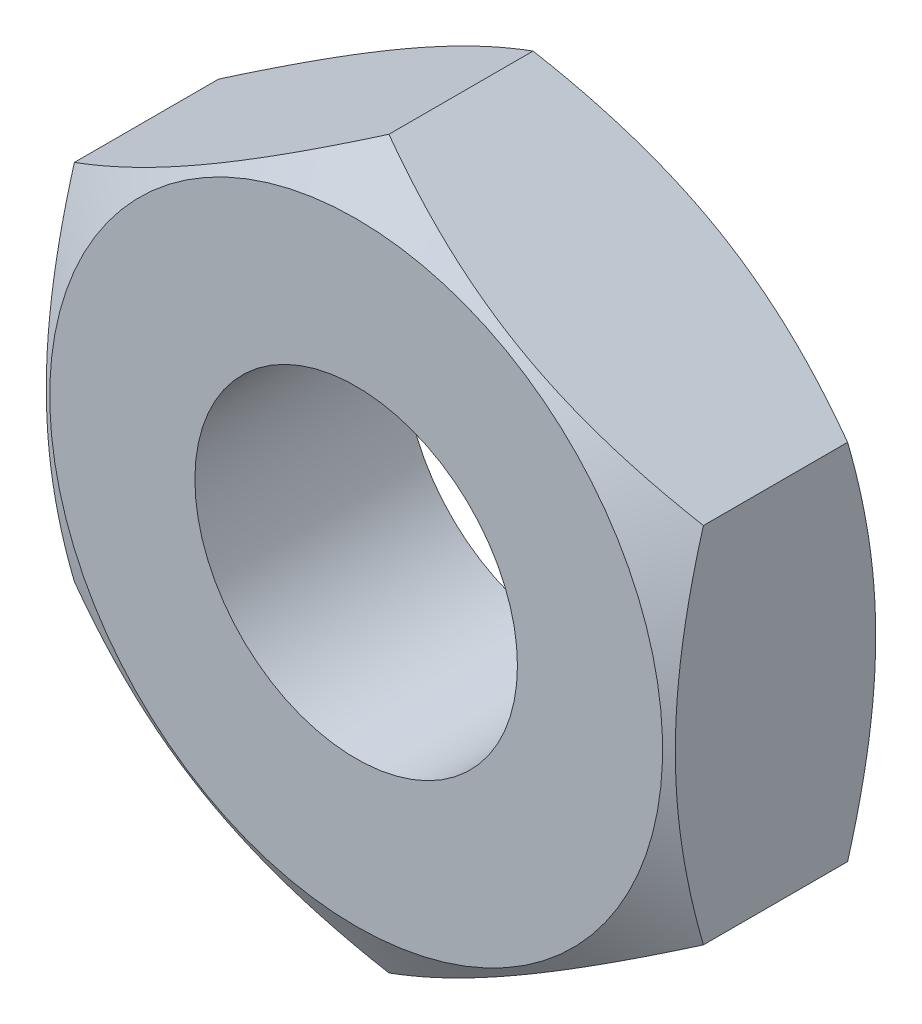
ISO-10303-21;
HEADER;
FILE_DESCRIPTION(('STEP AP214'),'2;1');
FILE_NAME('part.step','',(''),(''),'','','');
FILE_SCHEMA(('AUTOMOTIVE_DESIGN { 1 0 10303 214 1 1 1 1 }'));
ENDSEC;
DATA;
#1=APPLICATION_CONTEXT('core data for automotive mechanical design processes');
#2=APPLICATION_PROTOCOL_DEFINITION('international standard','automotive_design',2000,#1);
#3=PRODUCT_CONTEXT('',#1,'mechanical');
#4=PRODUCT('Part','Part','',(#3));
#5=PRODUCT_RELATED_PRODUCT_CATEGORY('part','',(#4));
#6=PRODUCT_DEFINITION_FORMATION('','',#4);
#7=PRODUCT_DEFINITION_CONTEXT('part definition',#1,'design');
#8=PRODUCT_DEFINITION('design','',#6,#7);
#9=PRODUCT_DEFINITION_SHAPE('','',#8);
#10=(LENGTH_UNIT() NAMED_UNIT(*) SI_UNIT(.MILLI.,.METRE.));
#11=(NAMED_UNIT(*) PLANE_ANGLE_UNIT() SI_UNIT($,.RADIAN.));
#12=(NAMED_UNIT(*) SI_UNIT($,.STERADIAN.) SOLID_ANGLE_UNIT());
#13=UNCERTAINTY_MEASURE_WITH_UNIT(LENGTH_MEASURE(1.E-05),#10,'distance_accuracy_value','');
#14=(GEOMETRIC_REPRESENTATION_CONTEXT(3) GLOBAL_UNCERTAINTY_ASSIGNED_CONTEXT((#13)) GLOBAL_UNIT_ASSIGNED_CONTEXT((#10,
#11,#12)) REPRESENTATION_CONTEXT('',''));
#15=CARTESIAN_POINT('',(0.,0.,0.));
#16=DIRECTION('',(0.,0.,1.));
#17=DIRECTION('',(1.,0.,0.));
#18=AXIS2_PLACEMENT_3D('',#15,#16,#17);
#19=CARTESIAN_POINT('',(0.,0.,1.3));
#20=DIRECTION('',(0.,0.,1.));
#21=DIRECTION('',(1.,0.,0.));
#22=AXIS2_PLACEMENT_3D('',#19,#20,#21);
#23=PLANE('',#22);
#24=CARTESIAN_POINT('',(0.,0.,1.3));
#25=DIRECTION('',(0.,0.,1.));
#26=DIRECTION('',(1.,0.,0.));
#27=AXIS2_PLACEMENT_3D('',#24,#25,#26);
#28=CIRCLE('',#27,1.);
#29=CARTESIAN_POINT('',(1.,0.,1.3));
#30=VERTEX_POINT('',#29);
#31=EDGE_CURVE('E115',#30,#30,#28,.T.);
#32=ORIENTED_EDGE('',*,*,#31,.F.);
#33=EDGE_LOOP('',(#32));
#34=FACE_BOUND('',#33,.T.);
#35=CARTESIAN_POINT('',(0.,0.,1.3));
#36=DIRECTION('',(0.,0.,1.));
#37=DIRECTION('',(0.,-1.,0.));
#38=AXIS2_PLACEMENT_3D('',#35,#36,#37);
#39=CIRCLE('',#38,1.9);
#40=CARTESIAN_POINT('',(0.,-1.9,1.3));
#41=VERTEX_POINT('',#40);
#42=EDGE_CURVE('E108',#41,#41,#39,.T.);
#43=ORIENTED_EDGE('',*,*,#42,.T.);
#44=EDGE_LOOP('',(#43));
#45=FACE_BOUND('',#44,.T.);
#46=ADVANCED_FACE('F36',(#34,#45),#23,.T.);
#47=CARTESIAN_POINT('',(0.,0.,0.));
#48=DIRECTION('',(0.,0.,1.));
#49=DIRECTION('',(1.,0.,0.));
#50=AXIS2_PLACEMENT_3D('',#47,#48,#49);
#51=PLANE('',#50);
#52=CARTESIAN_POINT('',(0.,0.,0.));
#53=DIRECTION('',(0.,0.,1.));
#54=DIRECTION('',(1.,0.,0.));
#55=AXIS2_PLACEMENT_3D('',#52,#53,#54);
#56=CIRCLE('',#55,1.);
#57=CARTESIAN_POINT('',(1.,0.,0.));
#58=VERTEX_POINT('',#57);
#59=EDGE_CURVE('E195',#58,#58,#56,.T.);
#60=ORIENTED_EDGE('',*,*,#59,.T.);
#61=EDGE_LOOP('',(#60));
#62=FACE_BOUND('',#61,.T.);
#63=CARTESIAN_POINT('',(0.,0.,0.));
#64=DIRECTION('',(0.,0.,1.));
#65=DIRECTION('',(0.,-1.,0.));
#66=AXIS2_PLACEMENT_3D('',#63,#64,#65);
#67=CIRCLE('',#66,1.9);
#68=CARTESIAN_POINT('',(0.,-1.9,0.));
#69=VERTEX_POINT('',#68);
#70=EDGE_CURVE('E217',#69,#69,#67,.T.);
#71=ORIENTED_EDGE('',*,*,#70,.F.);
#72=EDGE_LOOP('',(#71));
#73=FACE_BOUND('',#72,.T.);
#74=ADVANCED_FACE('F200',(#62,#73),#51,.F.);
#75=CARTESIAN_POINT('',(0.,0.,1.3));
#76=DIRECTION('',(0.,0.,-1.));
#77=DIRECTION('',(-1.,0.,0.));
#78=AXIS2_PLACEMENT_3D('',#75,#76,#77);
#79=CYLINDRICAL_SURFACE('',#78,1.);
#80=ORIENTED_EDGE('',*,*,#31,.T.);
#81=EDGE_LOOP('',(#80));
#82=FACE_BOUND('',#81,.T.);
#83=ORIENTED_EDGE('',*,*,#59,.F.);
#84=EDGE_LOOP('',(#83));
#85=FACE_BOUND('',#84,.T.);
#86=ADVANCED_FACE('F136',(#82,#85),#79,.F.);
#87=CARTESIAN_POINT('',(0.,0.,0.));
#88=DIRECTION('',(0.,0.,1.));
#89=DIRECTION('',(0.,-1.,0.));
#90=AXIS2_PLACEMENT_3D('',#87,#88,#89);
#91=CONICAL_SURFACE('',#90,1.9,1.04719755119659);
#92=ORIENTED_EDGE('',*,*,#70,.T.);
#93=EDGE_LOOP('',(#92));
#94=FACE_BOUND('',#93,.T.);
#95=CARTESIAN_POINT('',(1.95,-3.01412357062755,0.975668955348615));
#96=CARTESIAN_POINT('',(1.95,-2.92903782794884,0.93443505977196));
#97=CARTESIAN_POINT('',(1.95,-2.84375568637844,0.893599436545652));
#98=CARTESIAN_POINT('',(1.95,-2.67269412413965,0.81294893406325));
#99=CARTESIAN_POINT('',(1.95,-2.58691462676543,0.773134217685977));
#100=CARTESIAN_POINT('',(1.95,-2.414307090545,0.694547275824721));
#101=CARTESIAN_POINT('',(1.95,-2.32747587913931,0.655781994254316));
#102=CARTESIAN_POINT('',(1.95,-2.15311932004655,0.579851257331476));
#103=CARTESIAN_POINT('',(1.95,-2.06559400568914,0.542685725705999));
#104=CARTESIAN_POINT('',(1.95,-1.88691398070035,0.469227673671));
#105=CARTESIAN_POINT('',(1.95,-1.79573230094289,0.433000392203774));
#106=CARTESIAN_POINT('',(1.95,-1.61231715451437,0.363319471267221));
#107=CARTESIAN_POINT('',(1.95,-1.52008378592712,0.329865575511403));
#108=CARTESIAN_POINT('',(1.95,-1.33456658875307,0.266605328393311));
#109=CARTESIAN_POINT('',(1.95,-1.24128521000729,0.236791865351117));
#110=CARTESIAN_POINT('',(1.95,-1.053384509019,0.181779686924461));
#111=CARTESIAN_POINT('',(1.95,-0.958765621579301,0.15657950738157));
#112=CARTESIAN_POINT('',(1.95,-0.768659527742966,0.112143681714311));
#113=CARTESIAN_POINT('',(1.95,-0.673179938310397,0.0928760555926613));
#114=CARTESIAN_POINT('',(1.95,-0.481044685139464,0.061400356588822));
#115=CARTESIAN_POINT('',(1.95,-0.384389130454296,0.0491916341175885));
#116=CARTESIAN_POINT('',(1.95,-0.191639372884253,0.032970989015226));
#117=CARTESIAN_POINT('',(1.95,-0.0955542280348244,0.0288544872510814));
#118=CARTESIAN_POINT('',(1.95,0.0966116278792717,0.0288806223858111));
#119=CARTESIAN_POINT('',(1.95,0.192692338802003,0.0330234389685632));
#120=CARTESIAN_POINT('',(1.95,0.423801711941466,0.052559927726958));
#121=CARTESIAN_POINT('',(1.95,0.558498797282693,0.0718991133974967));
#122=CARTESIAN_POINT('',(1.95,0.82542389416129,0.123398592908946));
#123=CARTESIAN_POINT('',(1.95,0.95764932892324,0.155571562448242));
#124=CARTESIAN_POINT('',(1.95,1.22228940670491,0.230040389841523));
#125=CARTESIAN_POINT('',(1.95,1.35464415177668,0.272543477596809));
#126=CARTESIAN_POINT('',(1.95,1.61689691634488,0.364311980704714));
#127=CARTESIAN_POINT('',(1.95,1.74679561828244,0.413575485216861));
#128=CARTESIAN_POINT('',(1.95,2.04811719504485,0.53416783948814));
#129=CARTESIAN_POINT('',(1.95,2.21879429378613,0.60734105858785));
#130=CARTESIAN_POINT('',(1.95,2.55780255121915,0.75896561844231));
#131=CARTESIAN_POINT('',(1.95,2.72613309667796,0.837418308802652));
#132=CARTESIAN_POINT('',(1.95,3.06128174435966,0.997884283184612));
#133=CARTESIAN_POINT('',(1.95,3.22809821178325,1.0799009644798));
#134=CARTESIAN_POINT('',(1.95,3.56053412757571,1.24632763510264));
#135=CARTESIAN_POINT('',(1.95,3.72615353627982,1.33073770328351));
#136=CARTESIAN_POINT('',(1.95,4.04298616941857,1.49427845670639));
#137=CARTESIAN_POINT('',(1.95,4.19426856460931,1.57327547781696));
#138=CARTESIAN_POINT('',(1.95,4.49626868091635,1.73235219719295));
#139=CARTESIAN_POINT('',(1.95,4.64698638309302,1.81243193136437));
#140=CARTESIAN_POINT('',(1.95,4.94761914522595,1.97322608598776));
#141=CARTESIAN_POINT('',(1.95,5.09753526257818,2.05393853216987));
#142=CARTESIAN_POINT('',(1.95,5.39700518556908,2.2160141900077));
#143=CARTESIAN_POINT('',(1.95,5.54655901000312,2.29737736691952));
#144=CARTESIAN_POINT('',(1.95,5.69597890155467,2.37898403012575));
#145=B_SPLINE_CURVE_WITH_KNOTS('',3,(#95,#96,#97,#98,#99,#100,#101,#102,#103,#104,#105,#106,
#107,#108,#109,#110,#111,#112,#113,#114,#115,#116,#117,#118,#119,#120,#121,#122,#123,#124,#125,
#126,#127,#128,#129,#130,#131,#132,#133,#134,#135,#136,#137,#138,#139,#140,#141,#142,#143,#144),
.UNSPECIFIED.,.F.,.F.,(4,2,2,2,2,2,2,2,2,2,2,2,2,2,2,2,2,2,2,2,2,2,2,2,4),(0.,0.283655343616152,
0.567355664445745,0.852617451924754,1.13786562356363,1.43217533431475,1.72645781773986,
2.02015588918632,2.31376058487032,2.60575368785851,2.89771991617448,3.18588747055232,
3.47406129416769,3.88145513439104,4.28925235046899,4.70602569877255,5.12268148726297,
5.67963210956024,6.23672565150462,6.7943624044213,7.35201755079669,7.86401015222027,
8.37601977469947,8.88680572125796,9.39756457555213),.UNSPECIFIED.);
#146=CARTESIAN_POINT('',(1.95,-1.12583302492016,0.203034488539451));
#147=VERTEX_POINT('',#146);
#148=CARTESIAN_POINT('',(1.95,1.12583302491977,0.203034488539713));
#149=VERTEX_POINT('',#148);
#150=EDGE_CURVE('E50',#147,#149,#145,.T.);
#151=ORIENTED_EDGE('',*,*,#150,.F.);
#152=CARTESIAN_POINT('',(-0.000199999999999577,-2.25178151989338,0.203101160334322));
#153=CARTESIAN_POINT('',(0.0854940657181573,-2.20230602798305,0.174523841188044));
#154=CARTESIAN_POINT('',(0.171927833934327,-2.15240346863637,0.148533428770512));
#155=CARTESIAN_POINT('',(0.346292188356711,-2.05173416167353,0.103166025056144));
#156=CARTESIAN_POINT('',(0.434225873709692,-2.00096562476415,0.0838050845956072));
#157=CARTESIAN_POINT('',(0.609003424961355,-1.9000577585007,0.0536657587707725));
#158=CARTESIAN_POINT('',(0.695820392882437,-1.84993395870123,0.042686800628934));
#159=CARTESIAN_POINT('',(0.869863014828906,-1.74945040406997,0.0295781271068838));
#160=CARTESIAN_POINT('',(0.957088035886078,-1.69909101468254,0.0274375588156276));
#161=CARTESIAN_POINT('',(1.12008499136051,-1.60498467856229,0.031881025739307));
#162=CARTESIAN_POINT('',(1.195881275547,-1.56122367348365,0.0373740361868189));
#163=CARTESIAN_POINT('',(1.34698001102616,-1.47398677788054,0.0547866563354201));
#164=CARTESIAN_POINT('',(1.42228193935553,-1.43051118928908,0.0667122192416294));
#165=CARTESIAN_POINT('',(1.57369243296125,-1.34309430004769,0.0965263846321273));
#166=CARTESIAN_POINT('',(1.64978182624473,-1.29916406835299,0.114541419625799));
#167=CARTESIAN_POINT('',(1.80082549145705,-1.21195896758327,0.155428917852285));
#168=CARTESIAN_POINT('',(1.87578169979867,-1.16868298051981,0.178291768460977));
#169=CARTESIAN_POINT('',(1.9502,-1.12571755486593,0.203101160334322));
#170=B_SPLINE_CURVE_WITH_KNOTS('',3,(#152,#153,#154,#155,#156,#157,#158,#159,#160,#161,#162,
#163,#164,#165,#166,#167,#168,#169),.UNSPECIFIED.,.F.,.F.,(4,2,2,2,2,2,2,2,4),(0.,
0.309106424435227,0.618956030978744,0.921136277584676,1.22294535789453,1.48577777844868,
1.74885386382366,2.01776686978219,2.2861515589462),.UNSPECIFIED.);
#171=CARTESIAN_POINT('',(0.,-2.25166604983954,0.203034488539713));
#172=VERTEX_POINT('',#171);
#173=EDGE_CURVE('E93',#172,#147,#170,.T.);
#174=ORIENTED_EDGE('',*,*,#173,.F.);
#175=CARTESIAN_POINT('',(-1.9502,-1.12571755486593,0.203101160334322));
#176=CARTESIAN_POINT('',(-1.86450593428184,-1.17519304677626,0.174523841188044));
#177=CARTESIAN_POINT('',(-1.77807216606567,-1.22509560612294,0.148533428770512));
#178=CARTESIAN_POINT('',(-1.60370781164329,-1.32576491308578,0.103166025056144));
#179=CARTESIAN_POINT('',(-1.51577412629031,-1.37653344999516,0.0838050845956072));
#180=CARTESIAN_POINT('',(-1.34099657503864,-1.47744131625861,0.0536657587707726));
#181=CARTESIAN_POINT('',(-1.25417960711756,-1.52756511605808,0.042686800628934));
#182=CARTESIAN_POINT('',(-1.08013698517109,-1.62804867068934,0.0295781271068837));
#183=CARTESIAN_POINT('',(-0.992911964113922,-1.67840806007677,0.0274375588156275));
#184=CARTESIAN_POINT('',(-0.829915008639494,-1.77251439619702,0.0318810257393069));
#185=CARTESIAN_POINT('',(-0.754118724453002,-1.81627540127566,0.0373740361868188));
#186=CARTESIAN_POINT('',(-0.603019988973841,-1.90351229687877,0.05478665633542));
#187=CARTESIAN_POINT('',(-0.527718060644471,-1.94698788547023,0.0667122192416293));
#188=CARTESIAN_POINT('',(-0.37630756703875,-2.03440477471162,0.0965263846321271));
#189=CARTESIAN_POINT('',(-0.300218173755269,-2.07833500640632,0.114541419625799));
#190=CARTESIAN_POINT('',(-0.149174508542952,-2.16554010717604,0.155428917852285));
#191=CARTESIAN_POINT('',(-0.0742183002013339,-2.2088160942395,0.178291768460977));
#192=CARTESIAN_POINT('',(0.000200000000000515,-2.25178151989338,0.203101160334321));
#193=B_SPLINE_CURVE_WITH_KNOTS('',3,(#175,#176,#177,#178,#179,#180,#181,#182,#183,#184,#185,
#186,#187,#188,#189,#190,#191,#192),.UNSPECIFIED.,.F.,.F.,(4,2,2,2,2,2,2,2,4),(0.,
0.309106424435227,0.618956030978744,0.921136277584676,1.22294535789453,1.48577777844868,
1.74885386382366,2.01776686978219,2.2861515589462),.UNSPECIFIED.);
#194=CARTESIAN_POINT('',(-1.95,-1.12583302491977,0.203034488539713));
#195=VERTEX_POINT('',#194);
#196=EDGE_CURVE('E107',#195,#172,#193,.T.);
#197=ORIENTED_EDGE('',*,*,#196,.F.);
#198=CARTESIAN_POINT('',(-1.95,-3.01412357062755,0.975668955348615));
#199=CARTESIAN_POINT('',(-1.95,-2.92903782794884,0.93443505977196));
#200=CARTESIAN_POINT('',(-1.95,-2.84375568637844,0.893599436545651));
#201=CARTESIAN_POINT('',(-1.95,-2.67269412413965,0.81294893406325));
#202=CARTESIAN_POINT('',(-1.95,-2.58691462676543,0.773134217685977));
#203=CARTESIAN_POINT('',(-1.95,-2.414307090545,0.69454727582472));
#204=CARTESIAN_POINT('',(-1.95,-2.32747587913931,0.655781994254315));
#205=CARTESIAN_POINT('',(-1.95,-2.15311932004655,0.579851257331476));
#206=CARTESIAN_POINT('',(-1.95,-2.06559400568914,0.542685725705999));
#207=CARTESIAN_POINT('',(-1.95,-1.88691398070035,0.469227673670999));
#208=CARTESIAN_POINT('',(-1.95,-1.79573230094289,0.433000392203773));
#209=CARTESIAN_POINT('',(-1.95,-1.61231715451437,0.363319471267221));
#210=CARTESIAN_POINT('',(-1.95,-1.52008378592712,0.329865575511403));
#211=CARTESIAN_POINT('',(-1.95,-1.33456658875307,0.26660532839331));
#212=CARTESIAN_POINT('',(-1.95,-1.24128521000729,0.236791865351117));
#213=CARTESIAN_POINT('',(-1.95,-1.053384509019,0.181779686924461));
#214=CARTESIAN_POINT('',(-1.95,-0.958765621579302,0.15657950738157));
#215=CARTESIAN_POINT('',(-1.95,-0.768659527742967,0.112143681714311));
#216=CARTESIAN_POINT('',(-1.95,-0.673179938310398,0.0928760555926612));
#217=CARTESIAN_POINT('',(-1.95,-0.481044685139465,0.0614003565888219));
#218=CARTESIAN_POINT('',(-1.95,-0.384389130454297,0.0491916341175884));
#219=CARTESIAN_POINT('',(-1.95,-0.191639372884254,0.0329709890152259));
#220=CARTESIAN_POINT('',(-1.95,-0.0955542280348255,0.0288544872510813));
#221=CARTESIAN_POINT('',(-1.95,0.0966116278792708,0.0288806223858112));
#222=CARTESIAN_POINT('',(-1.95,0.192692338802002,0.0330234389685633));
#223=CARTESIAN_POINT('',(-1.95,0.423801711941465,0.0525599277269582));
#224=CARTESIAN_POINT('',(-1.95,0.558498797282692,0.0718991133974971));
#225=CARTESIAN_POINT('',(-1.95,0.825423894161289,0.123398592908946));
#226=CARTESIAN_POINT('',(-1.95,0.957649328923239,0.155571562448242));
#227=CARTESIAN_POINT('',(-1.95,1.2222894067049,0.230040389841523));
#228=CARTESIAN_POINT('',(-1.95,1.35464415177668,0.272543477596809));
#229=CARTESIAN_POINT('',(-1.95,1.61689691634488,0.364311980704715));
#230=CARTESIAN_POINT('',(-1.95,1.74679561828244,0.413575485216861));
#231=CARTESIAN_POINT('',(-1.95,2.04811719504485,0.53416783948814));
#232=CARTESIAN_POINT('',(-1.95,2.21879429378613,0.60734105858785));
#233=CARTESIAN_POINT('',(-1.95,2.55780255121915,0.75896561844231));
#234=CARTESIAN_POINT('',(-1.95,2.72613309667796,0.837418308802653));
#235=CARTESIAN_POINT('',(-1.95,3.06128174435966,0.997884283184612));
#236=CARTESIAN_POINT('',(-1.95,3.22809821178325,1.0799009644798));
#237=CARTESIAN_POINT('',(-1.95,3.5605341275757,1.24632763510264));
#238=CARTESIAN_POINT('',(-1.95,3.72615353627981,1.33073770328351));
#239=CARTESIAN_POINT('',(-1.95,4.04298616941857,1.49427845670639));
#240=CARTESIAN_POINT('',(-1.95,4.1942685646093,1.57327547781696));
#241=CARTESIAN_POINT('',(-1.95,4.49626868091635,1.73235219719295));
#242=CARTESIAN_POINT('',(-1.95,4.64698638309301,1.81243193136437));
#243=CARTESIAN_POINT('',(-1.95,4.94761914522595,1.97322608598776));
#244=CARTESIAN_POINT('',(-1.95,5.09753526257818,2.05393853216987));
#245=CARTESIAN_POINT('',(-1.95,5.39700518556907,2.2160141900077));
#246=CARTESIAN_POINT('',(-1.95,5.54655901000311,2.29737736691952));
#247=CARTESIAN_POINT('',(-1.95,5.69597890155467,2.37898403012575));
#248=B_SPLINE_CURVE_WITH_KNOTS('',3,(#198,#199,#200,#201,#202,#203,#204,#205,#206,#207,#208,
#209,#210,#211,#212,#213,#214,#215,#216,#217,#218,#219,#220,#221,#222,#223,#224,#225,#226,#227,
#228,#229,#230,#231,#232,#233,#234,#235,#236,#237,#238,#239,#240,#241,#242,#243,#244,#245,#246,
#247),.UNSPECIFIED.,.F.,.F.,(4,2,2,2,2,2,2,2,2,2,2,2,2,2,2,2,2,2,2,2,2,2,2,2,4),(0.,
0.283655343616152,0.567355664445745,0.852617451924754,1.13786562356363,1.43217533431475,
1.72645781773986,2.02015588918632,2.31376058487032,2.60575368785851,2.89771991617448,
3.18588747055232,3.47406129416769,3.88145513439104,4.28925235046899,4.70602569877255,
5.12268148726297,5.67963210956024,6.23672565150462,6.79436240442129,7.35201755079669,
7.86401015222027,8.37601977469947,8.88680572125796,9.39756457555213),.UNSPECIFIED.);
#249=CARTESIAN_POINT('',(-1.95,1.12583302491977,0.203034488539713));
#250=VERTEX_POINT('',#249);
#251=EDGE_CURVE('E156',#250,#195,#248,.F.);
#252=ORIENTED_EDGE('',*,*,#251,.F.);
#253=CARTESIAN_POINT('',(0.000199999999999537,2.25178151989338,0.203101160334322));
#254=CARTESIAN_POINT('',(-0.0854940657181574,2.20230602798305,0.174523841188045));
#255=CARTESIAN_POINT('',(-0.171927833934327,2.15240346863637,0.148533428770512));
#256=CARTESIAN_POINT('',(-0.346292188356712,2.05173416167353,0.103166025056145));
#257=CARTESIAN_POINT('',(-0.434225873709692,2.00096562476415,0.0838050845956074));
#258=CARTESIAN_POINT('',(-0.609003424961355,1.9000577585007,0.0536657587707727));
#259=CARTESIAN_POINT('',(-0.695820392882437,1.84993395870123,0.0426868006289342));
#260=CARTESIAN_POINT('',(-0.869863014828906,1.74945040406997,0.029578127106884));
#261=CARTESIAN_POINT('',(-0.957088035886078,1.69909101468254,0.0274375588156279));
#262=CARTESIAN_POINT('',(-1.12008499136051,1.60498467856229,0.0318810257393074));
#263=CARTESIAN_POINT('',(-1.195881275547,1.56122367348365,0.0373740361868193));
#264=CARTESIAN_POINT('',(-1.34698001102616,1.47398677788054,0.0547866563354206));
#265=CARTESIAN_POINT('',(-1.42228193935553,1.43051118928908,0.0667122192416299));
#266=CARTESIAN_POINT('',(-1.57369243296125,1.34309430004769,0.0965263846321277));
#267=CARTESIAN_POINT('',(-1.64978182624473,1.29916406835299,0.114541419625799));
#268=CARTESIAN_POINT('',(-1.80082549145705,1.21195896758327,0.155428917852285));
#269=CARTESIAN_POINT('',(-1.87578169979867,1.16868298051981,0.178291768460977));
#270=CARTESIAN_POINT('',(-1.9502,1.12571755486593,0.203101160334322));
#271=B_SPLINE_CURVE_WITH_KNOTS('',3,(#253,#254,#255,#256,#257,#258,#259,#260,#261,#262,#263,
#264,#265,#266,#267,#268,#269,#270),.UNSPECIFIED.,.F.,.F.,(4,2,2,2,2,2,2,2,4),(0.,
0.309106424435227,0.618956030978744,0.921136277584676,1.22294535789453,1.48577777844868,
1.74885386382366,2.01776686978219,2.2861515589462),.UNSPECIFIED.);
#272=CARTESIAN_POINT('',(0.,2.25166604983954,0.203034488539713));
#273=VERTEX_POINT('',#272);
#274=EDGE_CURVE('E162',#273,#250,#271,.T.);
#275=ORIENTED_EDGE('',*,*,#274,.F.);
#276=CARTESIAN_POINT('',(1.9502,1.12571755486593,0.203101160334322));
#277=CARTESIAN_POINT('',(1.86450593428184,1.17519304677626,0.174523841188045));
#278=CARTESIAN_POINT('',(1.77807216606567,1.22509560612294,0.148533428770512));
#279=CARTESIAN_POINT('',(1.60370781164329,1.32576491308578,0.103166025056145));
#280=CARTESIAN_POINT('',(1.51577412629031,1.37653344999516,0.0838050845956073));
#281=CARTESIAN_POINT('',(1.34099657503864,1.47744131625861,0.0536657587707727));
#282=CARTESIAN_POINT('',(1.25417960711756,1.52756511605808,0.0426868006289342));
#283=CARTESIAN_POINT('',(1.08013698517109,1.62804867068934,0.029578127106884));
#284=CARTESIAN_POINT('',(0.992911964113922,1.67840806007677,0.0274375588156278));
#285=CARTESIAN_POINT('',(0.829915008639494,1.77251439619702,0.0318810257393072));
#286=CARTESIAN_POINT('',(0.754118724453002,1.81627540127566,0.0373740361868192));
#287=CARTESIAN_POINT('',(0.603019988973841,1.90351229687877,0.0547866563354204));
#288=CARTESIAN_POINT('',(0.527718060644471,1.94698788547023,0.0667122192416297));
#289=CARTESIAN_POINT('',(0.37630756703875,2.03440477471162,0.0965263846321274));
#290=CARTESIAN_POINT('',(0.300218173755269,2.07833500640632,0.114541419625799));
#291=CARTESIAN_POINT('',(0.149174508542952,2.16554010717604,0.155428917852285));
#292=CARTESIAN_POINT('',(0.0742183002013338,2.2088160942395,0.178291768460977));
#293=CARTESIAN_POINT('',(-0.000200000000000499,2.25178151989338,0.203101160334322));
#294=B_SPLINE_CURVE_WITH_KNOTS('',3,(#276,#277,#278,#279,#280,#281,#282,#283,#284,#285,#286,
#287,#288,#289,#290,#291,#292,#293),.UNSPECIFIED.,.F.,.F.,(4,2,2,2,2,2,2,2,4),(0.,
0.309106424435227,0.618956030978744,0.921136277584676,1.22294535789453,1.48577777844868,
1.74885386382366,2.01776686978219,2.2861515589462),.UNSPECIFIED.);
#295=EDGE_CURVE('E64',#149,#273,#294,.T.);
#296=ORIENTED_EDGE('',*,*,#295,.F.);
#297=EDGE_LOOP('',(#151,#174,#197,#252,#275,#296));
#298=FACE_BOUND('',#297,.T.);
#299=ADVANCED_FACE('F92',(#94,#298),#91,.T.);
#300=CARTESIAN_POINT('',(0.,0.,1.3));
#301=DIRECTION('',(0.,0.,-1.));
#302=DIRECTION('',(0.,1.,0.));
#303=AXIS2_PLACEMENT_3D('',#300,#301,#302);
#304=CONICAL_SURFACE('',#303,1.9,1.04719755119659);
#305=ORIENTED_EDGE('',*,*,#42,.F.);
#306=EDGE_LOOP('',(#305));
#307=FACE_BOUND('',#306,.T.);
#308=CARTESIAN_POINT('',(1.9502,1.12571755486593,1.09689883966568));
#309=CARTESIAN_POINT('',(1.86450593428184,1.17519304677626,1.12547615881196));
#310=CARTESIAN_POINT('',(1.77807216606567,1.22509560612294,1.15146657122949));
#311=CARTESIAN_POINT('',(1.60370781164329,1.32576491308578,1.19683397494386));
#312=CARTESIAN_POINT('',(1.51577412629031,1.37653344999516,1.21619491540439));
#313=CARTESIAN_POINT('',(1.34099657503864,1.47744131625861,1.24633424122923));
#314=CARTESIAN_POINT('',(1.25417960711756,1.52756511605808,1.25731319937107));
#315=CARTESIAN_POINT('',(1.08013698517109,1.62804867068934,1.27042187289312));
#316=CARTESIAN_POINT('',(0.992911964113921,1.67840806007677,1.27256244118437));
#317=CARTESIAN_POINT('',(0.829915008639493,1.77251439619702,1.26811897426069));
#318=CARTESIAN_POINT('',(0.754118724453001,1.81627540127566,1.26262596381318));
#319=CARTESIAN_POINT('',(0.603019988973841,1.90351229687877,1.24521334366458));
#320=CARTESIAN_POINT('',(0.527718060644471,1.94698788547023,1.23328778075837));
#321=CARTESIAN_POINT('',(0.37630756703875,2.03440477471162,1.20347361536787));
#322=CARTESIAN_POINT('',(0.300218173755269,2.07833500640632,1.1854585803742));
#323=CARTESIAN_POINT('',(0.149174508542952,2.16554010717604,1.14457108214771));
#324=CARTESIAN_POINT('',(0.0742183002013342,2.2088160942395,1.12170823153902));
#325=CARTESIAN_POINT('',(-0.000200000000000563,2.25178151989338,1.09689883966568));
#326=B_SPLINE_CURVE_WITH_KNOTS('',3,(#308,#309,#310,#311,#312,#313,#314,#315,#316,#317,#318,
#319,#320,#321,#322,#323,#324,#325),.UNSPECIFIED.,.F.,.F.,(4,2,2,2,2,2,2,2,4),(0.,
0.309106424435227,0.618956030978744,0.921136277584676,1.22294535789453,1.48577777844868,
1.74885386382366,2.01776686978219,2.2861515589462),.UNSPECIFIED.);
#327=CARTESIAN_POINT('',(1.95,1.12583302491977,1.09696551146029));
#328=VERTEX_POINT('',#327);
#329=CARTESIAN_POINT('',(0.,2.25166604983954,1.09696551146029));
#330=VERTEX_POINT('',#329);
#331=EDGE_CURVE('E185',#328,#330,#326,.T.);
#332=ORIENTED_EDGE('',*,*,#331,.T.);
#333=CARTESIAN_POINT('',(0.000199999999999558,2.25178151989338,1.09689883966568));
#334=CARTESIAN_POINT('',(-0.0854940657181573,2.20230602798305,1.12547615881196));
#335=CARTESIAN_POINT('',(-0.171927833934327,2.15240346863637,1.15146657122949));
#336=CARTESIAN_POINT('',(-0.346292188356712,2.05173416167353,1.19683397494386));
#337=CARTESIAN_POINT('',(-0.434225873709692,2.00096562476415,1.21619491540439));
#338=CARTESIAN_POINT('',(-0.609003424961355,1.9000577585007,1.24633424122923));
#339=CARTESIAN_POINT('',(-0.695820392882437,1.84993395870123,1.25731319937107));
#340=CARTESIAN_POINT('',(-0.869863014828906,1.74945040406997,1.27042187289312));
#341=CARTESIAN_POINT('',(-0.957088035886078,1.69909101468254,1.27256244118437));
#342=CARTESIAN_POINT('',(-1.12008499136051,1.60498467856229,1.26811897426069));
#343=CARTESIAN_POINT('',(-1.195881275547,1.56122367348365,1.26262596381318));
#344=CARTESIAN_POINT('',(-1.34698001102616,1.47398677788054,1.24521334366458));
#345=CARTESIAN_POINT('',(-1.42228193935553,1.43051118928908,1.23328778075837));
#346=CARTESIAN_POINT('',(-1.57369243296125,1.34309430004769,1.20347361536787));
#347=CARTESIAN_POINT('',(-1.64978182624473,1.29916406835299,1.1854585803742));
#348=CARTESIAN_POINT('',(-1.80082549145705,1.21195896758327,1.14457108214771));
#349=CARTESIAN_POINT('',(-1.87578169979867,1.16868298051981,1.12170823153902));
#350=CARTESIAN_POINT('',(-1.9502,1.12571755486593,1.09689883966568));
#351=B_SPLINE_CURVE_WITH_KNOTS('',3,(#333,#334,#335,#336,#337,#338,#339,#340,#341,#342,#343,
#344,#345,#346,#347,#348,#349,#350),.UNSPECIFIED.,.F.,.F.,(4,2,2,2,2,2,2,2,4),(0.,
0.309106424435227,0.618956030978744,0.921136277584676,1.22294535789453,1.48577777844868,
1.74885386382366,2.01776686978219,2.2861515589462),.UNSPECIFIED.);
#352=CARTESIAN_POINT('',(-1.95,1.12583302491977,1.09696551146029));
#353=VERTEX_POINT('',#352);
#354=EDGE_CURVE('E179',#330,#353,#351,.T.);
#355=ORIENTED_EDGE('',*,*,#354,.T.);
#356=CARTESIAN_POINT('',(-1.95,-3.01412357062755,0.324331044651384));
#357=CARTESIAN_POINT('',(-1.95,-2.92903782794884,0.365564940228039));
#358=CARTESIAN_POINT('',(-1.95,-2.84375568637844,0.406400563454348));
#359=CARTESIAN_POINT('',(-1.95,-2.67269412413965,0.48705106593675));
#360=CARTESIAN_POINT('',(-1.95,-2.58691462676543,0.526865782314022));
#361=CARTESIAN_POINT('',(-1.95,-2.414307090545,0.605452724175279));
#362=CARTESIAN_POINT('',(-1.95,-2.32747587913931,0.644218005745684));
#363=CARTESIAN_POINT('',(-1.95,-2.15311932004655,0.720148742668523));
#364=CARTESIAN_POINT('',(-1.95,-2.06559400568914,0.757314274294));
#365=CARTESIAN_POINT('',(-1.95,-1.88691398070036,0.830772326329));
#366=CARTESIAN_POINT('',(-1.95,-1.79573230094289,0.866999607796226));
#367=CARTESIAN_POINT('',(-1.95,-1.61231715451437,0.936680528732778));
#368=CARTESIAN_POINT('',(-1.95,-1.52008378592712,0.970134424488596));
#369=CARTESIAN_POINT('',(-1.95,-1.33456658875307,1.03339467160669));
#370=CARTESIAN_POINT('',(-1.95,-1.24128521000729,1.06320813464888));
#371=CARTESIAN_POINT('',(-1.95,-1.053384509019,1.11822031307554));
#372=CARTESIAN_POINT('',(-1.95,-0.958765621579302,1.14342049261843));
#373=CARTESIAN_POINT('',(-1.95,-0.768659527742967,1.18785631828569));
#374=CARTESIAN_POINT('',(-1.95,-0.673179938310398,1.20712394440734));
#375=CARTESIAN_POINT('',(-1.95,-0.481044685139465,1.23859964341118));
#376=CARTESIAN_POINT('',(-1.95,-0.384389130454297,1.25080836588241));
#377=CARTESIAN_POINT('',(-1.95,-0.191639372884254,1.26702901098477));
#378=CARTESIAN_POINT('',(-1.95,-0.0955542280348257,1.27114551274892));
#379=CARTESIAN_POINT('',(-1.95,0.0966116278792704,1.27111937761419));
#380=CARTESIAN_POINT('',(-1.95,0.192692338802002,1.26697656103144));
#381=CARTESIAN_POINT('',(-1.95,0.423801711941466,1.24744007227304));
#382=CARTESIAN_POINT('',(-1.95,0.558498797282692,1.2281008866025));
#383=CARTESIAN_POINT('',(-1.95,0.82542389416129,1.17660140709105));
#384=CARTESIAN_POINT('',(-1.95,0.957649328923239,1.14442843755176));
#385=CARTESIAN_POINT('',(-1.95,1.22228940670491,1.06995961015848));
#386=CARTESIAN_POINT('',(-1.95,1.35464415177668,1.02745652240319));
#387=CARTESIAN_POINT('',(-1.95,1.61689691634488,0.935688019295285));
#388=CARTESIAN_POINT('',(-1.95,1.74679561828244,0.886424514783138));
#389=CARTESIAN_POINT('',(-1.95,2.04811719504485,0.76583216051186));
#390=CARTESIAN_POINT('',(-1.95,2.21879429378613,0.692658941412149));
#391=CARTESIAN_POINT('',(-1.95,2.55780255121915,0.541034381557689));
#392=CARTESIAN_POINT('',(-1.95,2.72613309667796,0.462581691197347));
#393=CARTESIAN_POINT('',(-1.95,3.06128174435966,0.302115716815387));
#394=CARTESIAN_POINT('',(-1.95,3.22809821178325,0.220099035520198));
#395=CARTESIAN_POINT('',(-1.95,3.56053412757571,0.0536723648973572));
#396=CARTESIAN_POINT('',(-1.95,3.72615353627982,-0.0307377032835135));
#397=CARTESIAN_POINT('',(-1.95,4.04298616941857,-0.19427845670639));
#398=CARTESIAN_POINT('',(-1.95,4.19426856460931,-0.273275477816956));
#399=CARTESIAN_POINT('',(-1.95,4.49626868091635,-0.432352197192946));
#400=CARTESIAN_POINT('',(-1.95,4.64698638309302,-0.512431931364371));
#401=CARTESIAN_POINT('',(-1.95,4.94761914522595,-0.673226085987761));
#402=CARTESIAN_POINT('',(-1.95,5.09753526257819,-0.753938532169872));
#403=CARTESIAN_POINT('',(-1.95,5.39700518556908,-0.9160141900077));
#404=CARTESIAN_POINT('',(-1.95,5.54655901000312,-0.997377366919521));
#405=CARTESIAN_POINT('',(-1.95,5.69597890155467,-1.07898403012575));
#406=B_SPLINE_CURVE_WITH_KNOTS('',3,(#356,#357,#358,#359,#360,#361,#362,#363,#364,#365,#366,
#367,#368,#369,#370,#371,#372,#373,#374,#375,#376,#377,#378,#379,#380,#381,#382,#383,#384,#385,
#386,#387,#388,#389,#390,#391,#392,#393,#394,#395,#396,#397,#398,#399,#400,#401,#402,#403,#404,
#405),.UNSPECIFIED.,.F.,.F.,(4,2,2,2,2,2,2,2,2,2,2,2,2,2,2,2,2,2,2,2,2,2,2,2,4),(0.,
0.283655343616152,0.567355664445744,0.852617451924753,1.13786562356363,1.43217533431475,
1.72645781773986,2.02015588918632,2.31376058487032,2.60575368785851,2.89771991617448,
3.18588747055232,3.47406129416769,3.88145513439104,4.28925235046899,4.70602569877256,
5.12268148726297,5.67963210956024,6.23672565150462,6.7943624044213,7.35201755079669,
7.86401015222027,8.37601977469947,8.88680572125796,9.39756457555213),.UNSPECIFIED.);
#407=CARTESIAN_POINT('',(-1.95,-1.12583302491977,1.09696551146029));
#408=VERTEX_POINT('',#407);
#409=EDGE_CURVE('E186',#353,#408,#406,.F.);
#410=ORIENTED_EDGE('',*,*,#409,.T.);
#411=CARTESIAN_POINT('',(-1.9502,-1.12571755486593,1.09689883966568));
#412=CARTESIAN_POINT('',(-1.86450593428184,-1.17519304677626,1.12547615881195));
#413=CARTESIAN_POINT('',(-1.77807216606567,-1.22509560612294,1.15146657122949));
#414=CARTESIAN_POINT('',(-1.60370781164329,-1.32576491308578,1.19683397494386));
#415=CARTESIAN_POINT('',(-1.51577412629031,-1.37653344999516,1.21619491540439));
#416=CARTESIAN_POINT('',(-1.34099657503864,-1.47744131625861,1.24633424122923));
#417=CARTESIAN_POINT('',(-1.25417960711756,-1.52756511605808,1.25731319937107));
#418=CARTESIAN_POINT('',(-1.08013698517109,-1.62804867068934,1.27042187289312));
#419=CARTESIAN_POINT('',(-0.992911964113922,-1.67840806007677,1.27256244118437));
#420=CARTESIAN_POINT('',(-0.829915008639494,-1.77251439619702,1.26811897426069));
#421=CARTESIAN_POINT('',(-0.754118724453002,-1.81627540127566,1.26262596381318));
#422=CARTESIAN_POINT('',(-0.603019988973841,-1.90351229687877,1.24521334366458));
#423=CARTESIAN_POINT('',(-0.527718060644471,-1.94698788547023,1.23328778075837));
#424=CARTESIAN_POINT('',(-0.37630756703875,-2.03440477471162,1.20347361536787));
#425=CARTESIAN_POINT('',(-0.300218173755269,-2.07833500640632,1.1854585803742));
#426=CARTESIAN_POINT('',(-0.149174508542952,-2.16554010717604,1.14457108214771));
#427=CARTESIAN_POINT('',(-0.074218300201334,-2.2088160942395,1.12170823153902));
#428=CARTESIAN_POINT('',(0.0002000000000005,-2.25178151989338,1.09689883966568));
#429=B_SPLINE_CURVE_WITH_KNOTS('',3,(#411,#412,#413,#414,#415,#416,#417,#418,#419,#420,#421,
#422,#423,#424,#425,#426,#427,#428),.UNSPECIFIED.,.F.,.F.,(4,2,2,2,2,2,2,2,4),(0.,
0.309106424435227,0.618956030978744,0.921136277584676,1.22294535789453,1.48577777844868,
1.74885386382366,2.01776686978219,2.2861515589462),.UNSPECIFIED.);
#430=CARTESIAN_POINT('',(0.,-2.25166604983954,1.09696551146029));
#431=VERTEX_POINT('',#430);
#432=EDGE_CURVE('E228',#408,#431,#429,.T.);
#433=ORIENTED_EDGE('',*,*,#432,.T.);
#434=CARTESIAN_POINT('',(-0.000199999999999563,-2.25178151989338,1.09689883966568));
#435=CARTESIAN_POINT('',(0.0854940657181574,-2.20230602798305,1.12547615881195));
#436=CARTESIAN_POINT('',(0.171927833934327,-2.15240346863637,1.15146657122949));
#437=CARTESIAN_POINT('',(0.346292188356711,-2.05173416167353,1.19683397494385));
#438=CARTESIAN_POINT('',(0.434225873709692,-2.00096562476415,1.21619491540439));
#439=CARTESIAN_POINT('',(0.609003424961355,-1.9000577585007,1.24633424122923));
#440=CARTESIAN_POINT('',(0.695820392882437,-1.84993395870123,1.25731319937107));
#441=CARTESIAN_POINT('',(0.869863014828906,-1.74945040406997,1.27042187289312));
#442=CARTESIAN_POINT('',(0.957088035886078,-1.69909101468254,1.27256244118437));
#443=CARTESIAN_POINT('',(1.12008499136051,-1.60498467856229,1.26811897426069));
#444=CARTESIAN_POINT('',(1.195881275547,-1.56122367348365,1.26262596381318));
#445=CARTESIAN_POINT('',(1.34698001102616,-1.47398677788054,1.24521334366458));
#446=CARTESIAN_POINT('',(1.42228193935553,-1.43051118928908,1.23328778075837));
#447=CARTESIAN_POINT('',(1.57369243296125,-1.34309430004769,1.20347361536787));
#448=CARTESIAN_POINT('',(1.64978182624473,-1.29916406835299,1.1854585803742));
#449=CARTESIAN_POINT('',(1.80082549145705,-1.21195896758327,1.14457108214771));
#450=CARTESIAN_POINT('',(1.87578169979867,-1.16868298051981,1.12170823153902));
#451=CARTESIAN_POINT('',(1.9502,-1.12571755486593,1.09689883966568));
#452=B_SPLINE_CURVE_WITH_KNOTS('',3,(#434,#435,#436,#437,#438,#439,#440,#441,#442,#443,#444,
#445,#446,#447,#448,#449,#450,#451),.UNSPECIFIED.,.F.,.F.,(4,2,2,2,2,2,2,2,4),(0.,
0.309106424435227,0.618956030978744,0.921136277584676,1.22294535789453,1.48577777844868,
1.74885386382366,2.01776686978219,2.2861515589462),.UNSPECIFIED.);
#453=CARTESIAN_POINT('',(1.95,-1.12583302491977,1.09696551146029));
#454=VERTEX_POINT('',#453);
#455=EDGE_CURVE('E56',#431,#454,#452,.T.);
#456=ORIENTED_EDGE('',*,*,#455,.T.);
#457=CARTESIAN_POINT('',(1.95,-3.01412357062755,0.324331044651384));
#458=CARTESIAN_POINT('',(1.95,-2.92903782794884,0.365564940228039));
#459=CARTESIAN_POINT('',(1.95,-2.84375568637844,0.406400563454348));
#460=CARTESIAN_POINT('',(1.95,-2.67269412413965,0.487051065936749));
#461=CARTESIAN_POINT('',(1.95,-2.58691462676543,0.526865782314022));
#462=CARTESIAN_POINT('',(1.95,-2.414307090545,0.605452724175278));
#463=CARTESIAN_POINT('',(1.95,-2.32747587913931,0.644218005745683));
#464=CARTESIAN_POINT('',(1.95,-2.15311932004655,0.720148742668523));
#465=CARTESIAN_POINT('',(1.95,-2.06559400568914,0.757314274294));
#466=CARTESIAN_POINT('',(1.95,-1.88691398070035,0.830772326328999));
#467=CARTESIAN_POINT('',(1.95,-1.79573230094289,0.866999607796225));
#468=CARTESIAN_POINT('',(1.95,-1.61231715451437,0.936680528732778));
#469=CARTESIAN_POINT('',(1.95,-1.52008378592712,0.970134424488596));
#470=CARTESIAN_POINT('',(1.95,-1.33456658875307,1.03339467160669));
#471=CARTESIAN_POINT('',(1.95,-1.24128521000729,1.06320813464888));
#472=CARTESIAN_POINT('',(1.95,-1.053384509019,1.11822031307554));
#473=CARTESIAN_POINT('',(1.95,-0.958765621579301,1.14342049261843));
#474=CARTESIAN_POINT('',(1.95,-0.768659527742966,1.18785631828569));
#475=CARTESIAN_POINT('',(1.95,-0.673179938310397,1.20712394440734));
#476=CARTESIAN_POINT('',(1.95,-0.481044685139464,1.23859964341118));
#477=CARTESIAN_POINT('',(1.95,-0.384389130454296,1.25080836588241));
#478=CARTESIAN_POINT('',(1.95,-0.191639372884253,1.26702901098477));
#479=CARTESIAN_POINT('',(1.95,-0.0955542280348247,1.27114551274892));
#480=CARTESIAN_POINT('',(1.95,0.0966116278792714,1.27111937761419));
#481=CARTESIAN_POINT('',(1.95,0.192692338802003,1.26697656103144));
#482=CARTESIAN_POINT('',(1.95,0.423801711941466,1.24744007227304));
#483=CARTESIAN_POINT('',(1.95,0.558498797282692,1.2281008866025));
#484=CARTESIAN_POINT('',(1.95,0.82542389416129,1.17660140709105));
#485=CARTESIAN_POINT('',(1.95,0.957649328923239,1.14442843755176));
#486=CARTESIAN_POINT('',(1.95,1.22228940670491,1.06995961015848));
#487=CARTESIAN_POINT('',(1.95,1.35464415177668,1.02745652240319));
#488=CARTESIAN_POINT('',(1.95,1.61689691634488,0.935688019295286));
#489=CARTESIAN_POINT('',(1.95,1.74679561828244,0.886424514783139));
#490=CARTESIAN_POINT('',(1.95,2.04811719504485,0.76583216051186));
#491=CARTESIAN_POINT('',(1.95,2.21879429378613,0.69265894141215));
#492=CARTESIAN_POINT('',(1.95,2.55780255121915,0.54103438155769));
#493=CARTESIAN_POINT('',(1.95,2.72613309667796,0.462581691197348));
#494=CARTESIAN_POINT('',(1.95,3.06128174435966,0.302115716815388));
#495=CARTESIAN_POINT('',(1.95,3.22809821178325,0.220099035520199));
#496=CARTESIAN_POINT('',(1.95,3.56053412757571,0.0536723648973578));
#497=CARTESIAN_POINT('',(1.95,3.72615353627982,-0.0307377032835126));
#498=CARTESIAN_POINT('',(1.95,4.04298616941857,-0.19427845670639));
#499=CARTESIAN_POINT('',(1.95,4.19426856460931,-0.273275477816956));
#500=CARTESIAN_POINT('',(1.95,4.49626868091635,-0.432352197192946));
#501=CARTESIAN_POINT('',(1.95,4.64698638309302,-0.512431931364371));
#502=CARTESIAN_POINT('',(1.95,4.94761914522595,-0.67322608598776));
#503=CARTESIAN_POINT('',(1.95,5.09753526257819,-0.753938532169872));
#504=CARTESIAN_POINT('',(1.95,5.39700518556908,-0.9160141900077));
#505=CARTESIAN_POINT('',(1.95,5.54655901000312,-0.997377366919521));
#506=CARTESIAN_POINT('',(1.95,5.69597890155467,-1.07898403012575));
#507=B_SPLINE_CURVE_WITH_KNOTS('',3,(#457,#458,#459,#460,#461,#462,#463,#464,#465,#466,#467,
#468,#469,#470,#471,#472,#473,#474,#475,#476,#477,#478,#479,#480,#481,#482,#483,#484,#485,#486,
#487,#488,#489,#490,#491,#492,#493,#494,#495,#496,#497,#498,#499,#500,#501,#502,#503,#504,#505,
#506),.UNSPECIFIED.,.F.,.F.,(4,2,2,2,2,2,2,2,2,2,2,2,2,2,2,2,2,2,2,2,2,2,2,2,4),(0.,
0.283655343616152,0.567355664445744,0.852617451924753,1.13786562356363,1.43217533431475,
1.72645781773986,2.02015588918632,2.31376058487032,2.60575368785851,2.89771991617448,
3.18588747055232,3.47406129416769,3.88145513439104,4.28925235046899,4.70602569877256,
5.12268148726298,5.67963210956025,6.23672565150463,6.7943624044213,7.3520175507967,
7.86401015222028,8.37601977469948,8.88680572125797,9.39756457555214),.UNSPECIFIED.);
#508=EDGE_CURVE('E11',#454,#328,#507,.T.);
#509=ORIENTED_EDGE('',*,*,#508,.T.);
#510=EDGE_LOOP('',(#332,#355,#410,#433,#456,#509));
#511=FACE_BOUND('',#510,.T.);
#512=ADVANCED_FACE('F135',(#307,#511),#304,.T.);
#513=CARTESIAN_POINT('',(1.95,-1.12583302491977,1.3));
#514=DIRECTION('',(-1.,0.,0.));
#515=DIRECTION('',(0.,-1.,0.));
#516=AXIS2_PLACEMENT_3D('',#513,#514,#515);
#517=PLANE('',#516);
#518=ORIENTED_EDGE('',*,*,#508,.F.);
#519=DIRECTION('',(0.,0.,-1.));
#520=VECTOR('',#519,1.);
#521=CARTESIAN_POINT('',(1.95,-1.12583302491977,1.3));
#522=LINE('',#521,#520);
#523=EDGE_CURVE('E104',#454,#147,#522,.T.);
#524=ORIENTED_EDGE('',*,*,#523,.T.);
#525=ORIENTED_EDGE('',*,*,#150,.T.);
#526=DIRECTION('',(0.,0.,-1.));
#527=VECTOR('',#526,1.);
#528=CARTESIAN_POINT('',(1.95,1.12583302491977,1.3));
#529=LINE('',#528,#527);
#530=EDGE_CURVE('E111',#328,#149,#529,.T.);
#531=ORIENTED_EDGE('',*,*,#530,.F.);
#532=EDGE_LOOP('',(#518,#524,#525,#531));
#533=FACE_BOUND('',#532,.T.);
#534=ADVANCED_FACE('F110',(#533),#517,.F.);
#535=CARTESIAN_POINT('',(0.,-2.25166604983954,1.3));
#536=DIRECTION('',(-0.5,0.866025403784439,0.));
#537=DIRECTION('',(-0.866025403784439,-0.5,0.));
#538=AXIS2_PLACEMENT_3D('',#535,#536,#537);
#539=PLANE('',#538);
#540=ORIENTED_EDGE('',*,*,#455,.F.);
#541=DIRECTION('',(0.,0.,-1.));
#542=VECTOR('',#541,1.);
#543=CARTESIAN_POINT('',(0.,-2.25166604983954,1.3));
#544=LINE('',#543,#542);
#545=EDGE_CURVE('E106',#431,#172,#544,.T.);
#546=ORIENTED_EDGE('',*,*,#545,.T.);
#547=ORIENTED_EDGE('',*,*,#173,.T.);
#548=ORIENTED_EDGE('',*,*,#523,.F.);
#549=EDGE_LOOP('',(#540,#546,#547,#548));
#550=FACE_BOUND('',#549,.T.);
#551=ADVANCED_FACE('F103',(#550),#539,.F.);
#552=CARTESIAN_POINT('',(-1.95,-1.12583302491977,1.3));
#553=DIRECTION('',(0.5,0.866025403784439,0.));
#554=DIRECTION('',(-0.866025403784439,0.5,0.));
#555=AXIS2_PLACEMENT_3D('',#552,#553,#554);
#556=PLANE('',#555);
#557=ORIENTED_EDGE('',*,*,#432,.F.);
#558=DIRECTION('',(0.,0.,-1.));
#559=VECTOR('',#558,1.);
#560=CARTESIAN_POINT('',(-1.95,-1.12583302491977,1.3));
#561=LINE('',#560,#559);
#562=EDGE_CURVE('E113',#408,#195,#561,.T.);
#563=ORIENTED_EDGE('',*,*,#562,.T.);
#564=ORIENTED_EDGE('',*,*,#196,.T.);
#565=ORIENTED_EDGE('',*,*,#545,.F.);
#566=EDGE_LOOP('',(#557,#563,#564,#565));
#567=FACE_BOUND('',#566,.T.);
#568=ADVANCED_FACE('F237',(#567),#556,.F.);
#569=CARTESIAN_POINT('',(-1.95,1.12583302491977,1.3));
#570=DIRECTION('',(1.,0.,0.));
#571=DIRECTION('',(0.,1.,0.));
#572=AXIS2_PLACEMENT_3D('',#569,#570,#571);
#573=PLANE('',#572);
#574=ORIENTED_EDGE('',*,*,#409,.F.);
#575=DIRECTION('',(0.,0.,-1.));
#576=VECTOR('',#575,1.);
#577=CARTESIAN_POINT('',(-1.95,1.12583302491977,1.3));
#578=LINE('',#577,#576);
#579=EDGE_CURVE('E121',#353,#250,#578,.T.);
#580=ORIENTED_EDGE('',*,*,#579,.T.);
#581=ORIENTED_EDGE('',*,*,#251,.T.);
#582=ORIENTED_EDGE('',*,*,#562,.F.);
#583=EDGE_LOOP('',(#574,#580,#581,#582));
#584=FACE_BOUND('',#583,.T.);
#585=ADVANCED_FACE('F174',(#584),#573,.F.);
#586=CARTESIAN_POINT('',(0.,2.25166604983954,1.3));
#587=DIRECTION('',(0.5,-0.866025403784439,0.));
#588=DIRECTION('',(0.866025403784439,0.5,0.));
#589=AXIS2_PLACEMENT_3D('',#586,#587,#588);
#590=PLANE('',#589);
#591=ORIENTED_EDGE('',*,*,#354,.F.);
#592=DIRECTION('',(0.,0.,-1.));
#593=VECTOR('',#592,1.);
#594=CARTESIAN_POINT('',(0.,2.25166604983954,1.3));
#595=LINE('',#594,#593);
#596=EDGE_CURVE('E99',#330,#273,#595,.T.);
#597=ORIENTED_EDGE('',*,*,#596,.T.);
#598=ORIENTED_EDGE('',*,*,#274,.T.);
#599=ORIENTED_EDGE('',*,*,#579,.F.);
#600=EDGE_LOOP('',(#591,#597,#598,#599));
#601=FACE_BOUND('',#600,.T.);
#602=ADVANCED_FACE('F171',(#601),#590,.F.);
#603=CARTESIAN_POINT('',(1.95,1.12583302491977,1.3));
#604=DIRECTION('',(-0.5,-0.866025403784439,0.));
#605=DIRECTION('',(0.866025403784439,-0.5,0.));
#606=AXIS2_PLACEMENT_3D('',#603,#604,#605);
#607=PLANE('',#606);
#608=ORIENTED_EDGE('',*,*,#331,.F.);
#609=ORIENTED_EDGE('',*,*,#530,.T.);
#610=ORIENTED_EDGE('',*,*,#295,.T.);
#611=ORIENTED_EDGE('',*,*,#596,.F.);
#612=EDGE_LOOP('',(#608,#609,#610,#611));
#613=FACE_BOUND('',#612,.T.);
#614=ADVANCED_FACE('F38',(#613),#607,.F.);
#615=CLOSED_SHELL('',(#46,#74,#86,#299,#512,#534,#551,#568,#585,#602,#614));
#616=MANIFOLD_SOLID_BREP('B2',#615);
#617=ADVANCED_BREP_SHAPE_REPRESENTATION('',(#18,#616),#14);
#618=SHAPE_DEFINITION_REPRESENTATION(#9,#617);
ENDSEC;
END-ISO-10303-21;
